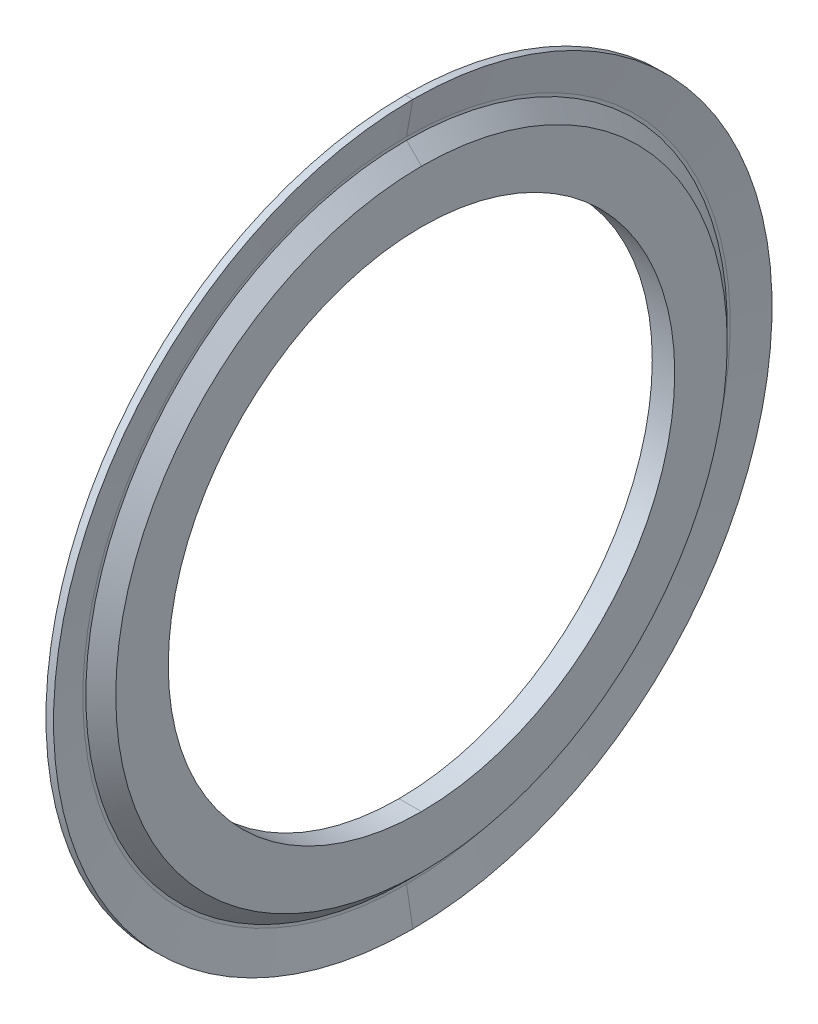
ISO-10303-21;
HEADER;
FILE_DESCRIPTION(('STEP AP214'),'2;1');
FILE_NAME('part.step','',(''),(''),'','','');
FILE_SCHEMA(('AUTOMOTIVE_DESIGN { 1 0 10303 214 1 1 1 1 }'));
ENDSEC;
DATA;
#1=APPLICATION_CONTEXT('core data for automotive mechanical design processes');
#2=APPLICATION_PROTOCOL_DEFINITION('international standard','automotive_design',2000,#1);
#3=PRODUCT_CONTEXT('',#1,'mechanical');
#4=PRODUCT('Part','Part','',(#3));
#5=PRODUCT_RELATED_PRODUCT_CATEGORY('part','',(#4));
#6=PRODUCT_DEFINITION_FORMATION('','',#4);
#7=PRODUCT_DEFINITION_CONTEXT('part definition',#1,'design');
#8=PRODUCT_DEFINITION('design','',#6,#7);
#9=PRODUCT_DEFINITION_SHAPE('','',#8);
#10=(LENGTH_UNIT() NAMED_UNIT(*) SI_UNIT(.MILLI.,.METRE.));
#11=(NAMED_UNIT(*) PLANE_ANGLE_UNIT() SI_UNIT($,.RADIAN.));
#12=(NAMED_UNIT(*) SI_UNIT($,.STERADIAN.) SOLID_ANGLE_UNIT());
#13=UNCERTAINTY_MEASURE_WITH_UNIT(LENGTH_MEASURE(1.E-05),#10,'distance_accuracy_value','');
#14=(GEOMETRIC_REPRESENTATION_CONTEXT(3) GLOBAL_UNCERTAINTY_ASSIGNED_CONTEXT((#13)) GLOBAL_UNIT_ASSIGNED_CONTEXT((#10,
#11,#12)) REPRESENTATION_CONTEXT('',''));
#15=CARTESIAN_POINT('',(0.,0.,0.));
#16=DIRECTION('',(0.,0.,1.));
#17=DIRECTION('',(1.,0.,0.));
#18=AXIS2_PLACEMENT_3D('',#15,#16,#17);
#19=CARTESIAN_POINT('',(3.64790554669992,3.8595,0.));
#20=DIRECTION('',(-1.,0.,0.));
#21=DIRECTION('',(0.,1.,0.));
#22=AXIS2_PLACEMENT_3D('',#19,#20,#21);
#23=PLANE('',#22);
#24=CARTESIAN_POINT('',(3.64790554669992,0.,0.));
#25=DIRECTION('',(1.,0.,0.));
#26=DIRECTION('',(0.,1.,0.));
#27=AXIS2_PLACEMENT_3D('',#24,#25,#26);
#28=CIRCLE('',#27,3.819);
#29=CARTESIAN_POINT('',(3.64790554669992,3.819,0.));
#30=VERTEX_POINT('',#29);
#31=CARTESIAN_POINT('',(3.64790554669992,-3.819,0.));
#32=VERTEX_POINT('',#31);
#33=EDGE_CURVE('E11',#30,#32,#28,.T.);
#34=ORIENTED_EDGE('',*,*,#33,.T.);
#35=CARTESIAN_POINT('',(3.64790554669992,0.,0.));
#36=DIRECTION('',(1.,0.,0.));
#37=DIRECTION('',(0.,1.,0.));
#38=AXIS2_PLACEMENT_3D('',#35,#36,#37);
#39=CIRCLE('',#38,3.819);
#40=EDGE_CURVE('E109',#32,#30,#39,.T.);
#41=ORIENTED_EDGE('',*,*,#40,.T.);
#42=EDGE_LOOP('',(#34,#41));
#43=FACE_BOUND('',#42,.T.);
#44=CARTESIAN_POINT('',(3.64790554669992,0.,0.));
#45=DIRECTION('',(1.,0.,0.));
#46=DIRECTION('',(0.,1.,0.));
#47=AXIS2_PLACEMENT_3D('',#44,#45,#46);
#48=CIRCLE('',#47,3.9);
#49=CARTESIAN_POINT('',(3.64790554669992,3.9,0.));
#50=VERTEX_POINT('',#49);
#51=CARTESIAN_POINT('',(3.64790554669992,-3.9,0.));
#52=VERTEX_POINT('',#51);
#53=EDGE_CURVE('E189',#50,#52,#48,.T.);
#54=ORIENTED_EDGE('',*,*,#53,.F.);
#55=CARTESIAN_POINT('',(3.64790554669992,0.,0.));
#56=DIRECTION('',(1.,0.,0.));
#57=DIRECTION('',(0.,1.,0.));
#58=AXIS2_PLACEMENT_3D('',#55,#56,#57);
#59=CIRCLE('',#58,3.9);
#60=EDGE_CURVE('E29',#52,#50,#59,.T.);
#61=ORIENTED_EDGE('',*,*,#60,.F.);
#62=EDGE_LOOP('',(#54,#61));
#63=FACE_BOUND('',#62,.T.);
#64=ADVANCED_FACE('F16',(#43,#63),#23,.T.);
#65=CARTESIAN_POINT('',(3.73790554669992,0.,0.));
#66=DIRECTION('',(-1.,0.,0.));
#67=DIRECTION('',(0.,1.,0.));
#68=AXIS2_PLACEMENT_3D('',#65,#66,#67);
#69=CONICAL_SURFACE('',#68,3.729,0.785398163397448);
#70=DIRECTION('',(0.707106781186548,-0.707106781186547,0.));
#71=VECTOR('',#70,1.);
#72=CARTESIAN_POINT('',(3.73790554669992,3.729,0.));
#73=LINE('',#72,#71);
#74=CARTESIAN_POINT('',(3.82790554669992,3.639,0.));
#75=VERTEX_POINT('',#74);
#76=EDGE_CURVE('E104',#30,#75,#73,.T.);
#77=ORIENTED_EDGE('',*,*,#76,.T.);
#78=CARTESIAN_POINT('',(3.82790554669992,0.,0.));
#79=DIRECTION('',(1.,0.,0.));
#80=DIRECTION('',(0.,1.,0.));
#81=AXIS2_PLACEMENT_3D('',#78,#79,#80);
#82=CIRCLE('',#81,3.639);
#83=CARTESIAN_POINT('',(3.82790554669992,-3.639,0.));
#84=VERTEX_POINT('',#83);
#85=EDGE_CURVE('E23',#75,#84,#82,.T.);
#86=ORIENTED_EDGE('',*,*,#85,.T.);
#87=DIRECTION('',(-0.707106781186548,-0.707106781186547,0.));
#88=VECTOR('',#87,1.);
#89=CARTESIAN_POINT('',(3.73790554669992,-3.729,0.));
#90=LINE('',#89,#88);
#91=EDGE_CURVE('E106',#84,#32,#90,.T.);
#92=ORIENTED_EDGE('',*,*,#91,.T.);
#93=ORIENTED_EDGE('',*,*,#33,.F.);
#94=EDGE_LOOP('',(#77,#86,#92,#93));
#95=FACE_BOUND('',#94,.T.);
#96=ADVANCED_FACE('F102',(#95),#69,.F.);
#97=CARTESIAN_POINT('',(3.82790554669992,3.387,0.));
#98=DIRECTION('',(-1.,0.,0.));
#99=DIRECTION('',(0.,1.,0.));
#100=AXIS2_PLACEMENT_3D('',#97,#98,#99);
#101=PLANE('',#100);
#102=CARTESIAN_POINT('',(3.82790554669992,0.,0.));
#103=DIRECTION('',(1.,0.,0.));
#104=DIRECTION('',(0.,1.,0.));
#105=AXIS2_PLACEMENT_3D('',#102,#103,#104);
#106=CIRCLE('',#105,3.135);
#107=CARTESIAN_POINT('',(3.82790554669992,3.135,0.));
#108=VERTEX_POINT('',#107);
#109=CARTESIAN_POINT('',(3.82790554669992,-3.135,0.));
#110=VERTEX_POINT('',#109);
#111=EDGE_CURVE('E148',#108,#110,#106,.T.);
#112=ORIENTED_EDGE('',*,*,#111,.T.);
#113=CARTESIAN_POINT('',(3.82790554669992,0.,0.));
#114=DIRECTION('',(1.,0.,0.));
#115=DIRECTION('',(0.,1.,0.));
#116=AXIS2_PLACEMENT_3D('',#113,#114,#115);
#117=CIRCLE('',#116,3.135);
#118=EDGE_CURVE('E173',#110,#108,#117,.T.);
#119=ORIENTED_EDGE('',*,*,#118,.T.);
#120=EDGE_LOOP('',(#112,#119));
#121=FACE_BOUND('',#120,.T.);
#122=ORIENTED_EDGE('',*,*,#85,.F.);
#123=CARTESIAN_POINT('',(3.82790554669992,0.,0.));
#124=DIRECTION('',(1.,0.,0.));
#125=DIRECTION('',(0.,1.,0.));
#126=AXIS2_PLACEMENT_3D('',#123,#124,#125);
#127=CIRCLE('',#126,3.639);
#128=EDGE_CURVE('E115',#84,#75,#127,.T.);
#129=ORIENTED_EDGE('',*,*,#128,.F.);
#130=EDGE_LOOP('',(#122,#129));
#131=FACE_BOUND('',#130,.T.);
#132=ADVANCED_FACE('F203',(#121,#131),#101,.T.);
#133=CARTESIAN_POINT('',(3.73790554669992,0.,0.));
#134=DIRECTION('',(1.,0.,0.));
#135=DIRECTION('',(0.,1.,0.));
#136=AXIS2_PLACEMENT_3D('',#133,#134,#135);
#137=CYLINDRICAL_SURFACE('',#136,3.135);
#138=DIRECTION('',(1.,0.,0.));
#139=VECTOR('',#138,1.);
#140=CARTESIAN_POINT('',(3.73790554669992,3.135,0.));
#141=LINE('',#140,#139);
#142=CARTESIAN_POINT('',(3.64790554669992,3.135,0.));
#143=VERTEX_POINT('',#142);
#144=EDGE_CURVE('E128',#143,#108,#141,.T.);
#145=ORIENTED_EDGE('',*,*,#144,.T.);
#146=ORIENTED_EDGE('',*,*,#118,.F.);
#147=DIRECTION('',(-1.,0.,0.));
#148=VECTOR('',#147,1.);
#149=CARTESIAN_POINT('',(3.73790554669992,-3.135,0.));
#150=LINE('',#149,#148);
#151=CARTESIAN_POINT('',(3.64790554669992,-3.135,0.));
#152=VERTEX_POINT('',#151);
#153=EDGE_CURVE('E140',#110,#152,#150,.T.);
#154=ORIENTED_EDGE('',*,*,#153,.T.);
#155=CARTESIAN_POINT('',(3.64790554669992,0.,0.));
#156=DIRECTION('',(1.,0.,0.));
#157=DIRECTION('',(0.,1.,0.));
#158=AXIS2_PLACEMENT_3D('',#155,#156,#157);
#159=CIRCLE('',#158,3.135);
#160=EDGE_CURVE('E137',#152,#143,#159,.T.);
#161=ORIENTED_EDGE('',*,*,#160,.T.);
#162=EDGE_LOOP('',(#145,#146,#154,#161));
#163=FACE_BOUND('',#162,.T.);
#164=ADVANCED_FACE('F205',(#163),#137,.T.);
#165=CARTESIAN_POINT('',(3.64790554669992,3.09,0.));
#166=DIRECTION('',(-1.,0.,0.));
#167=DIRECTION('',(0.,0.,1.));
#168=AXIS2_PLACEMENT_3D('',#165,#166,#167);
#169=PLANE('',#168);
#170=CARTESIAN_POINT('',(3.64790554669992,0.,0.));
#171=DIRECTION('',(1.,0.,0.));
#172=DIRECTION('',(0.,1.,0.));
#173=AXIS2_PLACEMENT_3D('',#170,#171,#172);
#174=CIRCLE('',#173,3.045);
#175=CARTESIAN_POINT('',(3.64790554669992,3.045,0.));
#176=VERTEX_POINT('',#175);
#177=CARTESIAN_POINT('',(3.64790554669992,-3.045,0.));
#178=VERTEX_POINT('',#177);
#179=EDGE_CURVE('E131',#176,#178,#174,.T.);
#180=ORIENTED_EDGE('',*,*,#179,.T.);
#181=CARTESIAN_POINT('',(3.64790554669992,0.,0.));
#182=DIRECTION('',(1.,0.,0.));
#183=DIRECTION('',(0.,1.,0.));
#184=AXIS2_PLACEMENT_3D('',#181,#182,#183);
#185=CIRCLE('',#184,3.045);
#186=EDGE_CURVE('E118',#178,#176,#185,.T.);
#187=ORIENTED_EDGE('',*,*,#186,.T.);
#188=EDGE_LOOP('',(#180,#187));
#189=FACE_BOUND('',#188,.T.);
#190=CARTESIAN_POINT('',(3.64790554669992,0.,0.));
#191=DIRECTION('',(1.,0.,0.));
#192=DIRECTION('',(0.,1.,0.));
#193=AXIS2_PLACEMENT_3D('',#190,#191,#192);
#194=CIRCLE('',#193,3.135);
#195=EDGE_CURVE('E135',#143,#152,#194,.T.);
#196=ORIENTED_EDGE('',*,*,#195,.F.);
#197=ORIENTED_EDGE('',*,*,#160,.F.);
#198=EDGE_LOOP('',(#196,#197));
#199=FACE_BOUND('',#198,.T.);
#200=ADVANCED_FACE('F213',(#189,#199),#169,.T.);
#201=CARTESIAN_POINT('',(3.78290554669992,0.,0.));
#202=DIRECTION('',(1.,0.,0.));
#203=DIRECTION('',(0.,1.,0.));
#204=AXIS2_PLACEMENT_3D('',#201,#202,#203);
#205=CYLINDRICAL_SURFACE('',#204,3.045);
#206=DIRECTION('',(1.,0.,0.));
#207=VECTOR('',#206,1.);
#208=CARTESIAN_POINT('',(3.78290554669992,3.045,0.));
#209=LINE('',#208,#207);
#210=CARTESIAN_POINT('',(3.91790554669992,3.045,0.));
#211=VERTEX_POINT('',#210);
#212=EDGE_CURVE('E122',#176,#211,#209,.T.);
#213=ORIENTED_EDGE('',*,*,#212,.T.);
#214=CARTESIAN_POINT('',(3.91790554669992,0.,0.));
#215=DIRECTION('',(1.,0.,0.));
#216=DIRECTION('',(0.,1.,0.));
#217=AXIS2_PLACEMENT_3D('',#214,#215,#216);
#218=CIRCLE('',#217,3.045);
#219=CARTESIAN_POINT('',(3.91790554669992,-3.045,0.));
#220=VERTEX_POINT('',#219);
#221=EDGE_CURVE('E129',#211,#220,#218,.T.);
#222=ORIENTED_EDGE('',*,*,#221,.T.);
#223=DIRECTION('',(-1.,0.,0.));
#224=VECTOR('',#223,1.);
#225=CARTESIAN_POINT('',(3.78290554669992,-3.045,0.));
#226=LINE('',#225,#224);
#227=EDGE_CURVE('E121',#220,#178,#226,.T.);
#228=ORIENTED_EDGE('',*,*,#227,.T.);
#229=ORIENTED_EDGE('',*,*,#179,.F.);
#230=EDGE_LOOP('',(#213,#222,#228,#229));
#231=FACE_BOUND('',#230,.T.);
#232=ADVANCED_FACE('F248',(#231),#205,.F.);
#233=CARTESIAN_POINT('',(3.91790554669992,3.36063961030679,0.));
#234=DIRECTION('',(1.,0.,0.));
#235=DIRECTION('',(0.,1.,0.));
#236=AXIS2_PLACEMENT_3D('',#233,#234,#235);
#237=PLANE('',#236);
#238=ORIENTED_EDGE('',*,*,#221,.F.);
#239=CARTESIAN_POINT('',(3.91790554669992,0.,0.));
#240=DIRECTION('',(1.,0.,0.));
#241=DIRECTION('',(0.,1.,0.));
#242=AXIS2_PLACEMENT_3D('',#239,#240,#241);
#243=CIRCLE('',#242,3.045);
#244=EDGE_CURVE('E126',#220,#211,#243,.T.);
#245=ORIENTED_EDGE('',*,*,#244,.F.);
#246=EDGE_LOOP('',(#238,#245));
#247=FACE_BOUND('',#246,.T.);
#248=CARTESIAN_POINT('',(3.91790554669992,0.,0.));
#249=DIRECTION('',(1.,0.,0.));
#250=DIRECTION('',(0.,1.,0.));
#251=AXIS2_PLACEMENT_3D('',#248,#249,#250);
#252=CIRCLE('',#251,3.67627922061358);
#253=CARTESIAN_POINT('',(3.91790554669992,3.67627922061358,0.));
#254=VERTEX_POINT('',#253);
#255=CARTESIAN_POINT('',(3.91790554669992,-3.67627922061358,0.));
#256=VERTEX_POINT('',#255);
#257=EDGE_CURVE('E151',#254,#256,#252,.T.);
#258=ORIENTED_EDGE('',*,*,#257,.T.);
#259=CARTESIAN_POINT('',(3.91790554669992,0.,0.));
#260=DIRECTION('',(1.,0.,0.));
#261=DIRECTION('',(0.,1.,0.));
#262=AXIS2_PLACEMENT_3D('',#259,#260,#261);
#263=CIRCLE('',#262,3.67627922061358);
#264=EDGE_CURVE('E132',#256,#254,#263,.T.);
#265=ORIENTED_EDGE('',*,*,#264,.T.);
#266=EDGE_LOOP('',(#258,#265));
#267=FACE_BOUND('',#266,.T.);
#268=ADVANCED_FACE('F258',(#247,#267),#237,.T.);
#269=CARTESIAN_POINT('',(3.82790554669992,0.,0.));
#270=DIRECTION('',(-1.,0.,0.));
#271=DIRECTION('',(0.,1.,0.));
#272=AXIS2_PLACEMENT_3D('',#269,#270,#271);
#273=CONICAL_SURFACE('',#272,3.76627922061358,0.785398163397446);
#274=DIRECTION('',(0.707106781186549,-0.707106781186546,0.));
#275=VECTOR('',#274,1.);
#276=CARTESIAN_POINT('',(3.82790554669992,3.76627922061358,0.));
#277=LINE('',#276,#275);
#278=CARTESIAN_POINT('',(3.73790554669992,3.85627922061358,0.));
#279=VERTEX_POINT('',#278);
#280=EDGE_CURVE('E145',#279,#254,#277,.T.);
#281=ORIENTED_EDGE('',*,*,#280,.T.);
#282=ORIENTED_EDGE('',*,*,#264,.F.);
#283=DIRECTION('',(-0.707106781186549,-0.707106781186546,0.));
#284=VECTOR('',#283,1.);
#285=CARTESIAN_POINT('',(3.82790554669992,-3.76627922061358,0.));
#286=LINE('',#285,#284);
#287=CARTESIAN_POINT('',(3.73790554669992,-3.85627922061358,0.));
#288=VERTEX_POINT('',#287);
#289=EDGE_CURVE('E144',#256,#288,#286,.T.);
#290=ORIENTED_EDGE('',*,*,#289,.T.);
#291=CARTESIAN_POINT('',(3.73790554669992,0.,0.));
#292=DIRECTION('',(1.,0.,0.));
#293=DIRECTION('',(0.,1.,0.));
#294=AXIS2_PLACEMENT_3D('',#291,#292,#293);
#295=CIRCLE('',#294,3.85627922061358);
#296=EDGE_CURVE('E199',#288,#279,#295,.T.);
#297=ORIENTED_EDGE('',*,*,#296,.T.);
#298=EDGE_LOOP('',(#281,#282,#290,#297));
#299=FACE_BOUND('',#298,.T.);
#300=ADVANCED_FACE('F268',(#299),#273,.T.);
#301=CARTESIAN_POINT('',(3.73790554669992,3.87420262044812,0.));
#302=DIRECTION('',(1.,0.,0.));
#303=DIRECTION('',(0.,1.,0.));
#304=AXIS2_PLACEMENT_3D('',#301,#302,#303);
#305=PLANE('',#304);
#306=CARTESIAN_POINT('',(3.73790554669992,0.,0.));
#307=DIRECTION('',(1.,0.,0.));
#308=DIRECTION('',(0.,1.,0.));
#309=AXIS2_PLACEMENT_3D('',#306,#307,#308);
#310=CIRCLE('',#309,3.85627922061358);
#311=EDGE_CURVE('E141',#279,#288,#310,.T.);
#312=ORIENTED_EDGE('',*,*,#311,.F.);
#313=ORIENTED_EDGE('',*,*,#296,.F.);
#314=EDGE_LOOP('',(#312,#313));
#315=FACE_BOUND('',#314,.T.);
#316=CARTESIAN_POINT('',(3.73790554669992,0.,0.));
#317=DIRECTION('',(1.,0.,0.));
#318=DIRECTION('',(0.,1.,0.));
#319=AXIS2_PLACEMENT_3D('',#316,#317,#318);
#320=CIRCLE('',#319,3.89212602028267);
#321=CARTESIAN_POINT('',(3.73790554669992,3.89212602028267,0.));
#322=VERTEX_POINT('',#321);
#323=CARTESIAN_POINT('',(3.73790554669992,-3.89212602028267,0.));
#324=VERTEX_POINT('',#323);
#325=EDGE_CURVE('E197',#322,#324,#320,.T.);
#326=ORIENTED_EDGE('',*,*,#325,.T.);
#327=CARTESIAN_POINT('',(3.73790554669992,0.,0.));
#328=DIRECTION('',(1.,0.,0.));
#329=DIRECTION('',(0.,1.,0.));
#330=AXIS2_PLACEMENT_3D('',#327,#328,#329);
#331=CIRCLE('',#330,3.89212602028267);
#332=EDGE_CURVE('E165',#324,#322,#331,.T.);
#333=ORIENTED_EDGE('',*,*,#332,.T.);
#334=EDGE_LOOP('',(#326,#333));
#335=FACE_BOUND('',#334,.T.);
#336=ADVANCED_FACE('F278',(#315,#335),#305,.T.);
#337=CARTESIAN_POINT('',(3.77562841018356,0.,0.));
#338=DIRECTION('',(1.,0.,0.));
#339=DIRECTION('',(0.,1.,0.));
#340=AXIS2_PLACEMENT_3D('',#337,#338,#339);
#341=CONICAL_SURFACE('',#340,4.10606301014133,1.39626340159546);
#342=DIRECTION('',(0.17364817766693,0.984807753012208,0.));
#343=VECTOR('',#342,1.);
#344=CARTESIAN_POINT('',(3.77562841018356,4.10606301014133,0.));
#345=LINE('',#344,#343);
#346=CARTESIAN_POINT('',(3.81335127366719,4.32,0.));
#347=VERTEX_POINT('',#346);
#348=EDGE_CURVE('E162',#322,#347,#345,.T.);
#349=ORIENTED_EDGE('',*,*,#348,.T.);
#350=CARTESIAN_POINT('',(3.81335127366719,0.,0.));
#351=DIRECTION('',(1.,0.,0.));
#352=DIRECTION('',(0.,1.,0.));
#353=AXIS2_PLACEMENT_3D('',#350,#351,#352);
#354=CIRCLE('',#353,4.32);
#355=CARTESIAN_POINT('',(3.81335127366719,-4.32,0.));
#356=VERTEX_POINT('',#355);
#357=EDGE_CURVE('E185',#347,#356,#354,.T.);
#358=ORIENTED_EDGE('',*,*,#357,.T.);
#359=DIRECTION('',(-0.17364817766693,0.984807753012208,0.));
#360=VECTOR('',#359,1.);
#361=CARTESIAN_POINT('',(3.77562841018356,-4.10606301014133,0.));
#362=LINE('',#361,#360);
#363=EDGE_CURVE('E168',#356,#324,#362,.T.);
#364=ORIENTED_EDGE('',*,*,#363,.T.);
#365=ORIENTED_EDGE('',*,*,#325,.F.);
#366=EDGE_LOOP('',(#349,#358,#364,#365));
#367=FACE_BOUND('',#366,.T.);
#368=ADVANCED_FACE('F287',(#367),#341,.F.);
#369=CARTESIAN_POINT('',(3.76765707613233,0.,0.));
#370=DIRECTION('',(1.,0.,0.));
#371=DIRECTION('',(0.,1.,0.));
#372=AXIS2_PLACEMENT_3D('',#369,#370,#371);
#373=CYLINDRICAL_SURFACE('',#372,4.32);
#374=DIRECTION('',(1.,0.,0.));
#375=VECTOR('',#374,1.);
#376=CARTESIAN_POINT('',(3.76765707613233,4.32,0.));
#377=LINE('',#376,#375);
#378=CARTESIAN_POINT('',(3.72196287859748,4.32,0.));
#379=VERTEX_POINT('',#378);
#380=EDGE_CURVE('E176',#379,#347,#377,.T.);
#381=ORIENTED_EDGE('',*,*,#380,.T.);
#382=CARTESIAN_POINT('',(3.81335127366719,0.,0.));
#383=DIRECTION('',(1.,0.,0.));
#384=DIRECTION('',(0.,1.,0.));
#385=AXIS2_PLACEMENT_3D('',#382,#383,#384);
#386=CIRCLE('',#385,4.32);
#387=EDGE_CURVE('E171',#356,#347,#386,.T.);
#388=ORIENTED_EDGE('',*,*,#387,.F.);
#389=DIRECTION('',(-1.,0.,0.));
#390=VECTOR('',#389,1.);
#391=CARTESIAN_POINT('',(3.76765707613233,-4.32,0.));
#392=LINE('',#391,#390);
#393=CARTESIAN_POINT('',(3.72196287859748,-4.32,0.));
#394=VERTEX_POINT('',#393);
#395=EDGE_CURVE('E182',#356,#394,#392,.T.);
#396=ORIENTED_EDGE('',*,*,#395,.T.);
#397=CARTESIAN_POINT('',(3.72196287859748,0.,0.));
#398=DIRECTION('',(1.,0.,0.));
#399=DIRECTION('',(0.,1.,0.));
#400=AXIS2_PLACEMENT_3D('',#397,#398,#399);
#401=CIRCLE('',#400,4.32);
#402=EDGE_CURVE('E194',#394,#379,#401,.T.);
#403=ORIENTED_EDGE('',*,*,#402,.T.);
#404=EDGE_LOOP('',(#381,#388,#396,#403));
#405=FACE_BOUND('',#404,.T.);
#406=ADVANCED_FACE('F297',(#405),#373,.T.);
#407=CARTESIAN_POINT('',(3.6849342126487,0.,0.));
#408=DIRECTION('',(1.,0.,0.));
#409=DIRECTION('',(0.,1.,0.));
#410=AXIS2_PLACEMENT_3D('',#407,#408,#409);
#411=CONICAL_SURFACE('',#410,4.11,1.39626340159546);
#412=DIRECTION('',(0.17364817766693,0.984807753012208,0.));
#413=VECTOR('',#412,1.);
#414=CARTESIAN_POINT('',(3.6849342126487,4.11,0.));
#415=LINE('',#414,#413);
#416=EDGE_CURVE('E187',#50,#379,#415,.T.);
#417=ORIENTED_EDGE('',*,*,#416,.T.);
#418=ORIENTED_EDGE('',*,*,#402,.F.);
#419=DIRECTION('',(-0.17364817766693,0.984807753012208,0.));
#420=VECTOR('',#419,1.);
#421=CARTESIAN_POINT('',(3.6849342126487,-4.11,0.));
#422=LINE('',#421,#420);
#423=EDGE_CURVE('E192',#394,#52,#422,.T.);
#424=ORIENTED_EDGE('',*,*,#423,.T.);
#425=ORIENTED_EDGE('',*,*,#60,.T.);
#426=EDGE_LOOP('',(#417,#418,#424,#425));
#427=FACE_BOUND('',#426,.T.);
#428=ADVANCED_FACE('F307',(#427),#411,.T.);
#429=CARTESIAN_POINT('',(3.6849342126487,0.,0.));
#430=DIRECTION('',(1.,0.,0.));
#431=DIRECTION('',(0.,1.,0.));
#432=AXIS2_PLACEMENT_3D('',#429,#430,#431);
#433=CONICAL_SURFACE('',#432,4.11,1.39626340159546);
#434=ORIENTED_EDGE('',*,*,#416,.F.);
#435=ORIENTED_EDGE('',*,*,#53,.T.);
#436=ORIENTED_EDGE('',*,*,#423,.F.);
#437=CARTESIAN_POINT('',(3.72196287859748,0.,0.));
#438=DIRECTION('',(1.,0.,0.));
#439=DIRECTION('',(0.,1.,0.));
#440=AXIS2_PLACEMENT_3D('',#437,#438,#439);
#441=CIRCLE('',#440,4.32);
#442=EDGE_CURVE('E179',#379,#394,#441,.T.);
#443=ORIENTED_EDGE('',*,*,#442,.F.);
#444=EDGE_LOOP('',(#434,#435,#436,#443));
#445=FACE_BOUND('',#444,.T.);
#446=ADVANCED_FACE('F317',(#445),#433,.T.);
#447=CARTESIAN_POINT('',(3.76765707613233,0.,0.));
#448=DIRECTION('',(1.,0.,0.));
#449=DIRECTION('',(0.,1.,0.));
#450=AXIS2_PLACEMENT_3D('',#447,#448,#449);
#451=CYLINDRICAL_SURFACE('',#450,4.32);
#452=ORIENTED_EDGE('',*,*,#380,.F.);
#453=ORIENTED_EDGE('',*,*,#442,.T.);
#454=ORIENTED_EDGE('',*,*,#395,.F.);
#455=ORIENTED_EDGE('',*,*,#357,.F.);
#456=EDGE_LOOP('',(#452,#453,#454,#455));
#457=FACE_BOUND('',#456,.T.);
#458=ADVANCED_FACE('F326',(#457),#451,.T.);
#459=CARTESIAN_POINT('',(3.77562841018356,0.,0.));
#460=DIRECTION('',(1.,0.,0.));
#461=DIRECTION('',(0.,1.,0.));
#462=AXIS2_PLACEMENT_3D('',#459,#460,#461);
#463=CONICAL_SURFACE('',#462,4.10606301014133,1.39626340159546);
#464=ORIENTED_EDGE('',*,*,#348,.F.);
#465=ORIENTED_EDGE('',*,*,#332,.F.);
#466=ORIENTED_EDGE('',*,*,#363,.F.);
#467=ORIENTED_EDGE('',*,*,#387,.T.);
#468=EDGE_LOOP('',(#464,#465,#466,#467));
#469=FACE_BOUND('',#468,.T.);
#470=ADVANCED_FACE('F336',(#469),#463,.F.);
#471=CARTESIAN_POINT('',(3.82790554669992,0.,0.));
#472=DIRECTION('',(-1.,0.,0.));
#473=DIRECTION('',(0.,1.,0.));
#474=AXIS2_PLACEMENT_3D('',#471,#472,#473);
#475=CONICAL_SURFACE('',#474,3.76627922061358,0.785398163397446);
#476=ORIENTED_EDGE('',*,*,#280,.F.);
#477=ORIENTED_EDGE('',*,*,#311,.T.);
#478=ORIENTED_EDGE('',*,*,#289,.F.);
#479=ORIENTED_EDGE('',*,*,#257,.F.);
#480=EDGE_LOOP('',(#476,#477,#478,#479));
#481=FACE_BOUND('',#480,.T.);
#482=ADVANCED_FACE('F346',(#481),#475,.T.);
#483=CARTESIAN_POINT('',(3.78290554669992,0.,0.));
#484=DIRECTION('',(1.,0.,0.));
#485=DIRECTION('',(0.,1.,0.));
#486=AXIS2_PLACEMENT_3D('',#483,#484,#485);
#487=CYLINDRICAL_SURFACE('',#486,3.045);
#488=ORIENTED_EDGE('',*,*,#212,.F.);
#489=ORIENTED_EDGE('',*,*,#186,.F.);
#490=ORIENTED_EDGE('',*,*,#227,.F.);
#491=ORIENTED_EDGE('',*,*,#244,.T.);
#492=EDGE_LOOP('',(#488,#489,#490,#491));
#493=FACE_BOUND('',#492,.T.);
#494=ADVANCED_FACE('F356',(#493),#487,.F.);
#495=CARTESIAN_POINT('',(3.73790554669992,0.,0.));
#496=DIRECTION('',(1.,0.,0.));
#497=DIRECTION('',(0.,1.,0.));
#498=AXIS2_PLACEMENT_3D('',#495,#496,#497);
#499=CYLINDRICAL_SURFACE('',#498,3.135);
#500=ORIENTED_EDGE('',*,*,#144,.F.);
#501=ORIENTED_EDGE('',*,*,#195,.T.);
#502=ORIENTED_EDGE('',*,*,#153,.F.);
#503=ORIENTED_EDGE('',*,*,#111,.F.);
#504=EDGE_LOOP('',(#500,#501,#502,#503));
#505=FACE_BOUND('',#504,.T.);
#506=ADVANCED_FACE('F366',(#505),#499,.T.);
#507=CARTESIAN_POINT('',(3.73790554669992,0.,0.));
#508=DIRECTION('',(-1.,0.,0.));
#509=DIRECTION('',(0.,1.,0.));
#510=AXIS2_PLACEMENT_3D('',#507,#508,#509);
#511=CONICAL_SURFACE('',#510,3.729,0.785398163397448);
#512=ORIENTED_EDGE('',*,*,#76,.F.);
#513=ORIENTED_EDGE('',*,*,#40,.F.);
#514=ORIENTED_EDGE('',*,*,#91,.F.);
#515=ORIENTED_EDGE('',*,*,#128,.T.);
#516=EDGE_LOOP('',(#512,#513,#514,#515));
#517=FACE_BOUND('',#516,.T.);
#518=ADVANCED_FACE('F113',(#517),#511,.F.);
#519=CLOSED_SHELL('',(#64,#96,#132,#164,#200,#232,#268,#300,#336,#368,#406,#428,#446,#458,#470,
#482,#494,#506,#518));
#520=MANIFOLD_SOLID_BREP('B1',#519);
#521=ADVANCED_BREP_SHAPE_REPRESENTATION('',(#18,#520),#14);
#522=SHAPE_DEFINITION_REPRESENTATION(#9,#521);
ENDSEC;
END-ISO-10303-21;
